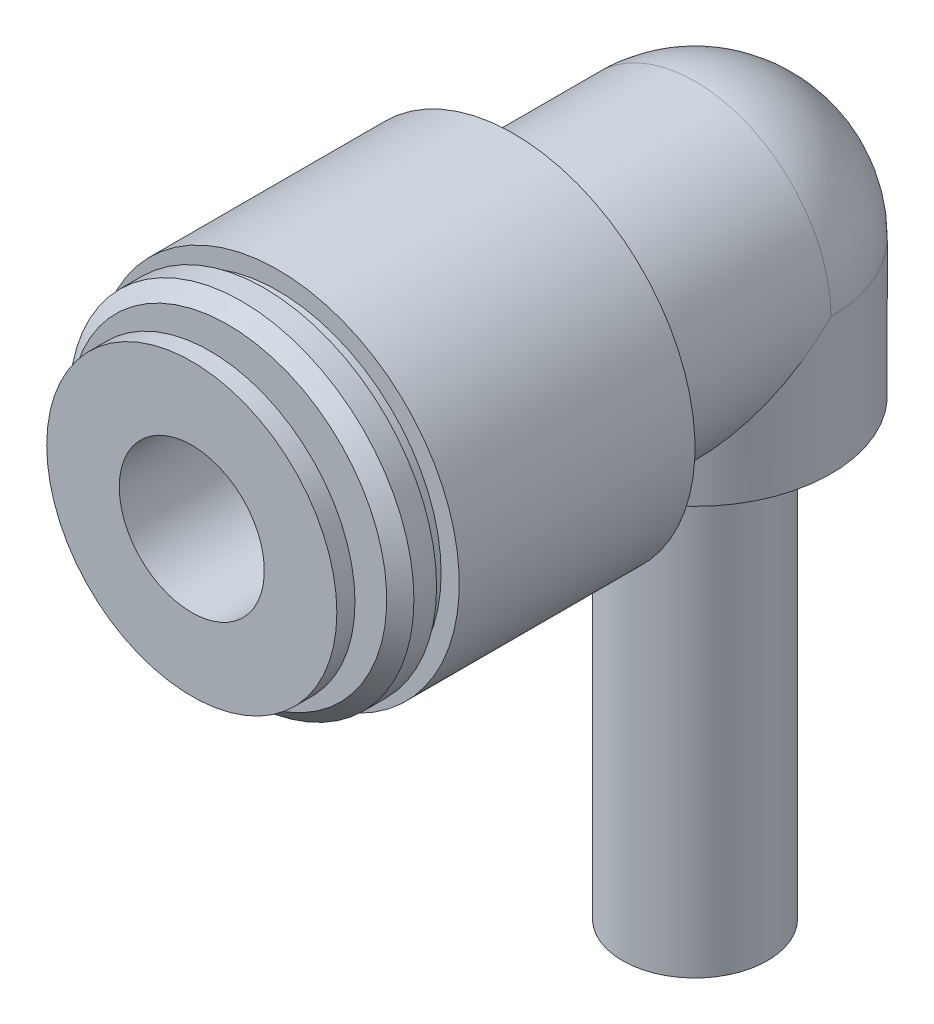
ISO-10303-21;
HEADER;
FILE_DESCRIPTION(('STEP AP214'),'2;1');
FILE_NAME('part.step','',(''),(''),'','','');
FILE_SCHEMA(('AUTOMOTIVE_DESIGN { 1 0 10303 214 1 1 1 1 }'));
ENDSEC;
DATA;
#1=APPLICATION_CONTEXT('core data for automotive mechanical design processes');
#2=APPLICATION_PROTOCOL_DEFINITION('international standard','automotive_design',2000,#1);
#3=PRODUCT_CONTEXT('',#1,'mechanical');
#4=PRODUCT('Part','Part','',(#3));
#5=PRODUCT_RELATED_PRODUCT_CATEGORY('part','',(#4));
#6=PRODUCT_DEFINITION_FORMATION('','',#4);
#7=PRODUCT_DEFINITION_CONTEXT('part definition',#1,'design');
#8=PRODUCT_DEFINITION('design','',#6,#7);
#9=PRODUCT_DEFINITION_SHAPE('','',#8);
#10=(LENGTH_UNIT() NAMED_UNIT(*) SI_UNIT(.MILLI.,.METRE.));
#11=(NAMED_UNIT(*) PLANE_ANGLE_UNIT() SI_UNIT($,.RADIAN.));
#12=(NAMED_UNIT(*) SI_UNIT($,.STERADIAN.) SOLID_ANGLE_UNIT());
#13=UNCERTAINTY_MEASURE_WITH_UNIT(LENGTH_MEASURE(1.E-05),#10,'distance_accuracy_value','');
#14=(GEOMETRIC_REPRESENTATION_CONTEXT(3) GLOBAL_UNCERTAINTY_ASSIGNED_CONTEXT((#13)) GLOBAL_UNIT_ASSIGNED_CONTEXT((#10,
#11,#12)) REPRESENTATION_CONTEXT('',''));
#15=CARTESIAN_POINT('',(0.,0.,0.));
#16=DIRECTION('',(0.,0.,1.));
#17=DIRECTION('',(1.,0.,0.));
#18=AXIS2_PLACEMENT_3D('',#15,#16,#17);
#19=CARTESIAN_POINT('',(0.,25.,0.));
#20=DIRECTION('',(0.,-1.,0.));
#21=DIRECTION('',(0.,0.,-1.));
#22=AXIS2_PLACEMENT_3D('',#19,#20,#21);
#23=CYLINDRICAL_SURFACE('',#22,7.5);
#24=CARTESIAN_POINT('',(0.,32.5,0.));
#25=DIRECTION('',(0.,-1.,0.));
#26=DIRECTION('',(0.,0.,-1.));
#27=AXIS2_PLACEMENT_3D('',#24,#25,#26);
#28=CIRCLE('',#27,7.5);
#29=CARTESIAN_POINT('',(-7.5,32.5,0.));
#30=VERTEX_POINT('',#29);
#31=CARTESIAN_POINT('',(7.5,32.5,0.));
#32=VERTEX_POINT('',#31);
#33=EDGE_CURVE('E68',#30,#32,#28,.T.);
#34=ORIENTED_EDGE('',*,*,#33,.T.);
#35=CARTESIAN_POINT('',(0.,32.5,0.));
#36=DIRECTION('',(0.,-0.707106781186547,-0.707106781186547));
#37=DIRECTION('',(0.,-0.707106781186547,0.707106781186547));
#38=AXIS2_PLACEMENT_3D('',#35,#36,#37);
#39=ELLIPSE('',#38,10.6066017177982,7.5);
#40=CARTESIAN_POINT('',(0.,25.,7.5));
#41=VERTEX_POINT('',#40);
#42=EDGE_CURVE('E51',#32,#41,#39,.T.);
#43=ORIENTED_EDGE('',*,*,#42,.T.);
#44=CARTESIAN_POINT('',(0.,25.,0.));
#45=DIRECTION('',(0.,-1.,0.));
#46=DIRECTION('',(0.,0.,-1.));
#47=AXIS2_PLACEMENT_3D('',#44,#45,#46);
#48=CIRCLE('',#47,7.5);
#49=EDGE_CURVE('E70',#41,#41,#48,.T.);
#50=ORIENTED_EDGE('',*,*,#49,.F.);
#51=EDGE_CURVE('E55',#41,#30,#39,.T.);
#52=ORIENTED_EDGE('',*,*,#51,.T.);
#53=EDGE_LOOP('',(#34,#43,#50,#52));
#54=FACE_BOUND('',#53,.T.);
#55=ADVANCED_FACE('F36',(#54),#23,.T.);
#56=CARTESIAN_POINT('',(0.,32.5,0.));
#57=DIRECTION('',(0.,-1.,0.));
#58=DIRECTION('',(1.,0.,0.));
#59=AXIS2_PLACEMENT_3D('',#56,#57,#58);
#60=SPHERICAL_SURFACE('',#59,7.5);
#61=ORIENTED_EDGE('',*,*,#33,.F.);
#62=CARTESIAN_POINT('',(0.,32.5,0.));
#63=DIRECTION('',(0.,0.,1.));
#64=DIRECTION('',(1.,0.,0.));
#65=AXIS2_PLACEMENT_3D('',#62,#63,#64);
#66=CIRCLE('',#65,7.5);
#67=EDGE_CURVE('E57',#32,#30,#66,.T.);
#68=ORIENTED_EDGE('',*,*,#67,.F.);
#69=EDGE_LOOP('',(#61,#68));
#70=FACE_BOUND('',#69,.T.);
#71=ADVANCED_FACE('F72',(#70),#60,.T.);
#72=CARTESIAN_POINT('',(0.,0.,0.));
#73=DIRECTION('',(0.,1.,0.));
#74=DIRECTION('',(0.,0.,1.));
#75=AXIS2_PLACEMENT_3D('',#72,#73,#74);
#76=PLANE('',#75);
#77=CARTESIAN_POINT('',(0.,0.,0.));
#78=DIRECTION('',(0.,1.,0.));
#79=DIRECTION('',(0.,0.,1.));
#80=AXIS2_PLACEMENT_3D('',#77,#78,#79);
#81=CIRCLE('',#80,4.);
#82=CARTESIAN_POINT('',(0.,0.,4.));
#83=VERTEX_POINT('',#82);
#84=EDGE_CURVE('E40',#83,#83,#81,.T.);
#85=ORIENTED_EDGE('',*,*,#84,.F.);
#86=EDGE_LOOP('',(#85));
#87=FACE_BOUND('',#86,.T.);
#88=CARTESIAN_POINT('',(0.,0.,0.));
#89=DIRECTION('',(0.,1.,0.));
#90=DIRECTION('',(0.,0.,1.));
#91=AXIS2_PLACEMENT_3D('',#88,#89,#90);
#92=CIRCLE('',#91,3.);
#93=CARTESIAN_POINT('',(0.,0.,3.));
#94=VERTEX_POINT('',#93);
#95=EDGE_CURVE('E79',#94,#94,#92,.T.);
#96=ORIENTED_EDGE('',*,*,#95,.T.);
#97=EDGE_LOOP('',(#96));
#98=FACE_BOUND('',#97,.T.);
#99=ADVANCED_FACE('F87',(#87,#98),#76,.F.);
#100=CARTESIAN_POINT('',(0.,25.,0.));
#101=DIRECTION('',(0.,-1.,0.));
#102=DIRECTION('',(0.,0.,-1.));
#103=AXIS2_PLACEMENT_3D('',#100,#101,#102);
#104=CYLINDRICAL_SURFACE('',#103,4.);
#105=CARTESIAN_POINT('',(0.,25.,0.));
#106=DIRECTION('',(0.,1.,0.));
#107=DIRECTION('',(0.,0.,1.));
#108=AXIS2_PLACEMENT_3D('',#105,#106,#107);
#109=CIRCLE('',#108,4.);
#110=CARTESIAN_POINT('',(0.,25.,4.));
#111=VERTEX_POINT('',#110);
#112=EDGE_CURVE('E11',#111,#111,#109,.T.);
#113=ORIENTED_EDGE('',*,*,#112,.F.);
#114=EDGE_LOOP('',(#113));
#115=FACE_BOUND('',#114,.T.);
#116=ORIENTED_EDGE('',*,*,#84,.T.);
#117=EDGE_LOOP('',(#116));
#118=FACE_BOUND('',#117,.T.);
#119=ADVANCED_FACE('F38',(#115,#118),#104,.T.);
#120=CARTESIAN_POINT('',(0.,25.,0.));
#121=DIRECTION('',(0.,-1.,0.));
#122=DIRECTION('',(0.,0.,-1.));
#123=AXIS2_PLACEMENT_3D('',#120,#121,#122);
#124=CYLINDRICAL_SURFACE('',#123,3.);
#125=CARTESIAN_POINT('',(0.,25.,0.));
#126=DIRECTION('',(0.,1.,0.));
#127=DIRECTION('',(0.,0.,1.));
#128=AXIS2_PLACEMENT_3D('',#125,#126,#127);
#129=CIRCLE('',#128,3.);
#130=CARTESIAN_POINT('',(0.,25.,3.));
#131=VERTEX_POINT('',#130);
#132=EDGE_CURVE('E74',#131,#131,#129,.T.);
#133=ORIENTED_EDGE('',*,*,#132,.T.);
#134=EDGE_LOOP('',(#133));
#135=FACE_BOUND('',#134,.T.);
#136=ORIENTED_EDGE('',*,*,#95,.F.);
#137=EDGE_LOOP('',(#136));
#138=FACE_BOUND('',#137,.T.);
#139=ADVANCED_FACE('F93',(#135,#138),#124,.F.);
#140=CARTESIAN_POINT('',(0.,25.,0.));
#141=DIRECTION('',(0.,-1.,0.));
#142=DIRECTION('',(0.,0.,-1.));
#143=AXIS2_PLACEMENT_3D('',#140,#141,#142);
#144=PLANE('',#143);
#145=ORIENTED_EDGE('',*,*,#132,.F.);
#146=EDGE_LOOP('',(#145));
#147=FACE_BOUND('',#146,.T.);
#148=ADVANCED_FACE('F105',(#147),#144,.T.);
#149=ORIENTED_EDGE('',*,*,#49,.T.);
#150=EDGE_LOOP('',(#149));
#151=FACE_BOUND('',#150,.T.);
#152=ORIENTED_EDGE('',*,*,#112,.T.);
#153=EDGE_LOOP('',(#152));
#154=FACE_BOUND('',#153,.T.);
#155=ADVANCED_FACE('F103',(#151,#154),#144,.T.);
#156=CARTESIAN_POINT('',(0.,32.5,10.));
#157=DIRECTION('',(0.,0.,-1.));
#158=DIRECTION('',(-1.,0.,0.));
#159=AXIS2_PLACEMENT_3D('',#156,#157,#158);
#160=CYLINDRICAL_SURFACE('',#159,7.5);
#161=ORIENTED_EDGE('',*,*,#42,.F.);
#162=ORIENTED_EDGE('',*,*,#67,.T.);
#163=ORIENTED_EDGE('',*,*,#51,.F.);
#164=EDGE_LOOP('',(#161,#162,#163));
#165=FACE_BOUND('',#164,.T.);
#166=CARTESIAN_POINT('',(0.,32.5,10.));
#167=DIRECTION('',(0.,0.,1.));
#168=DIRECTION('',(1.,0.,0.));
#169=AXIS2_PLACEMENT_3D('',#166,#167,#168);
#170=CIRCLE('',#169,7.5);
#171=CARTESIAN_POINT('',(7.5,32.5,10.));
#172=VERTEX_POINT('',#171);
#173=EDGE_CURVE('E63',#172,#172,#170,.T.);
#174=ORIENTED_EDGE('',*,*,#173,.F.);
#175=EDGE_LOOP('',(#174));
#176=FACE_BOUND('',#175,.T.);
#177=ADVANCED_FACE('F58',(#165,#176),#160,.T.);
#178=CARTESIAN_POINT('',(0.,32.5,23.));
#179=DIRECTION('',(0.,0.,-1.));
#180=DIRECTION('',(-1.,0.,0.));
#181=AXIS2_PLACEMENT_3D('',#178,#179,#180);
#182=CYLINDRICAL_SURFACE('',#181,10.);
#183=CARTESIAN_POINT('',(0.,32.5,23.));
#184=DIRECTION('',(0.,0.,1.));
#185=DIRECTION('',(1.,0.,0.));
#186=AXIS2_PLACEMENT_3D('',#183,#184,#185);
#187=CIRCLE('',#186,10.);
#188=CARTESIAN_POINT('',(-10.,32.5,23.));
#189=VERTEX_POINT('',#188);
#190=EDGE_CURVE('E64',#189,#189,#187,.T.);
#191=CARTESIAN_POINT('',(0.,32.5,10.));
#192=DIRECTION('',(0.,0.,1.));
#193=DIRECTION('',(1.,0.,0.));
#194=AXIS2_PLACEMENT_3D('',#191,#192,#193);
#195=CIRCLE('',#194,10.);
#196=CARTESIAN_POINT('',(-10.,32.5,10.));
#197=VERTEX_POINT('',#196);
#198=EDGE_CURVE('E345',#197,#197,#195,.T.);
#199=CARTESIAN_POINT('',(-10.,32.5,23.));
#200=CARTESIAN_POINT('',(-10.,32.5,22.8645833333333));
#201=CARTESIAN_POINT('',(-10.,32.5,22.7291666666667));
#202=CARTESIAN_POINT('',(-10.,32.5,22.4583333333333));
#203=CARTESIAN_POINT('',(-10.,32.5,22.3229166666667));
#204=CARTESIAN_POINT('',(-10.,32.5,22.0520833333333));
#205=CARTESIAN_POINT('',(-10.,32.5,21.9166666666667));
#206=CARTESIAN_POINT('',(-10.,32.5,21.6458333333333));
#207=CARTESIAN_POINT('',(-10.,32.5,21.5104166666667));
#208=CARTESIAN_POINT('',(-10.,32.5,21.2395833333333));
#209=CARTESIAN_POINT('',(-10.,32.5,21.1041666666667));
#210=CARTESIAN_POINT('',(-10.,32.5,20.8333333333333));
#211=CARTESIAN_POINT('',(-10.,32.5,20.6979166666667));
#212=CARTESIAN_POINT('',(-10.,32.5,20.4270833333333));
#213=CARTESIAN_POINT('',(-10.,32.5,20.2916666666667));
#214=CARTESIAN_POINT('',(-10.,32.5,20.0208333333333));
#215=CARTESIAN_POINT('',(-10.,32.5,19.8854166666667));
#216=CARTESIAN_POINT('',(-10.,32.5,19.6145833333333));
#217=CARTESIAN_POINT('',(-10.,32.5,19.4791666666667));
#218=CARTESIAN_POINT('',(-10.,32.5,19.2083333333333));
#219=CARTESIAN_POINT('',(-10.,32.5,19.0729166666667));
#220=CARTESIAN_POINT('',(-10.,32.5,18.8020833333333));
#221=CARTESIAN_POINT('',(-10.,32.5,18.6666666666667));
#222=CARTESIAN_POINT('',(-10.,32.5,18.3958333333333));
#223=CARTESIAN_POINT('',(-10.,32.5,18.2604166666667));
#224=CARTESIAN_POINT('',(-10.,32.5,17.9895833333333));
#225=CARTESIAN_POINT('',(-10.,32.5,17.8541666666667));
#226=CARTESIAN_POINT('',(-10.,32.5,17.5833333333333));
#227=CARTESIAN_POINT('',(-10.,32.5,17.4479166666667));
#228=CARTESIAN_POINT('',(-10.,32.5,17.1770833333333));
#229=CARTESIAN_POINT('',(-10.,32.5,17.0416666666667));
#230=CARTESIAN_POINT('',(-10.,32.5,16.7708333333333));
#231=CARTESIAN_POINT('',(-10.,32.5,16.6354166666667));
#232=CARTESIAN_POINT('',(-10.,32.5,16.3645833333333));
#233=CARTESIAN_POINT('',(-10.,32.5,16.2291666666667));
#234=CARTESIAN_POINT('',(-10.,32.5,15.9583333333333));
#235=CARTESIAN_POINT('',(-10.,32.5,15.8229166666667));
#236=CARTESIAN_POINT('',(-10.,32.5,15.5520833333333));
#237=CARTESIAN_POINT('',(-10.,32.5,15.4166666666667));
#238=CARTESIAN_POINT('',(-10.,32.5,15.1458333333333));
#239=CARTESIAN_POINT('',(-10.,32.5,15.0104166666667));
#240=CARTESIAN_POINT('',(-10.,32.5,14.7395833333333));
#241=CARTESIAN_POINT('',(-10.,32.5,14.6041666666667));
#242=CARTESIAN_POINT('',(-10.,32.5,14.3333333333333));
#243=CARTESIAN_POINT('',(-10.,32.5,14.1979166666667));
#244=CARTESIAN_POINT('',(-10.,32.5,13.9270833333333));
#245=CARTESIAN_POINT('',(-10.,32.5,13.7916666666667));
#246=CARTESIAN_POINT('',(-10.,32.5,13.5208333333333));
#247=CARTESIAN_POINT('',(-10.,32.5,13.3854166666667));
#248=CARTESIAN_POINT('',(-10.,32.5,13.1145833333333));
#249=CARTESIAN_POINT('',(-10.,32.5,12.9791666666667));
#250=CARTESIAN_POINT('',(-10.,32.5,12.7083333333333));
#251=CARTESIAN_POINT('',(-10.,32.5,12.5729166666667));
#252=CARTESIAN_POINT('',(-10.,32.5,12.3020833333333));
#253=CARTESIAN_POINT('',(-10.,32.5,12.1666666666667));
#254=CARTESIAN_POINT('',(-10.,32.5,11.8958333333333));
#255=CARTESIAN_POINT('',(-10.,32.5,11.7604166666667));
#256=CARTESIAN_POINT('',(-10.,32.5,11.4895833333333));
#257=CARTESIAN_POINT('',(-10.,32.5,11.3541666666667));
#258=CARTESIAN_POINT('',(-10.,32.5,11.0833333333333));
#259=CARTESIAN_POINT('',(-10.,32.5,10.9479166666667));
#260=CARTESIAN_POINT('',(-10.,32.5,10.6770833333333));
#261=CARTESIAN_POINT('',(-10.,32.5,10.5416666666667));
#262=CARTESIAN_POINT('',(-10.,32.5,10.2708333333333));
#263=CARTESIAN_POINT('',(-10.,32.5,10.1354166666667));
#264=CARTESIAN_POINT('',(-10.,32.5,10.));
#265=B_SPLINE_CURVE_WITH_KNOTS('',3,(#199,#200,#201,#202,#203,#204,#205,#206,#207,#208,#209,
#210,#211,#212,#213,#214,#215,#216,#217,#218,#219,#220,#221,#222,#223,#224,#225,#226,#227,#228,
#229,#230,#231,#232,#233,#234,#235,#236,#237,#238,#239,#240,#241,#242,#243,#244,#245,#246,#247,
#248,#249,#250,#251,#252,#253,#254,#255,#256,#257,#258,#259,#260,#261,#262,#263,#264),
.UNSPECIFIED.,.F.,.F.,(4,2,2,2,2,2,2,2,2,2,2,2,2,2,2,2,2,2,2,2,2,2,2,2,2,2,2,2,2,2,2,2,4),(0.,
0.406249999999997,0.812499999999997,1.21875,1.625,2.03125,2.4375,2.84375,3.25,3.65625,4.0625,
4.46875,4.875,5.28125,5.6875,6.09375,6.5,6.90625,7.3125,7.71875,8.125,8.53124999999999,8.9375,
9.34375,9.75,10.15625,10.5625,10.96875,11.375,11.78125,12.1875,12.59375,13.),.UNSPECIFIED.);
#266=EDGE_CURVE('BSEAM127',#189,#197,#265,.T.);
#267=ORIENTED_EDGE('',*,*,#190,.F.);
#268=ORIENTED_EDGE('',*,*,#198,.T.);
#269=ORIENTED_EDGE('',*,*,#266,.T.);
#270=ORIENTED_EDGE('',*,*,#266,.F.);
#271=EDGE_LOOP('',(#267,#269,#268,#270));
#272=FACE_BOUND('',#271,.T.);
#273=ADVANCED_FACE('F127',(#272),#182,.T.);
#274=CARTESIAN_POINT('',(0.,32.5,23.));
#275=DIRECTION('',(0.,0.,1.));
#276=DIRECTION('',(1.,0.,0.));
#277=AXIS2_PLACEMENT_3D('',#274,#275,#276);
#278=PLANE('',#277);
#279=CARTESIAN_POINT('',(0.,32.5,23.));
#280=DIRECTION('',(0.,0.,-1.));
#281=DIRECTION('',(-1.,0.,0.));
#282=AXIS2_PLACEMENT_3D('',#279,#280,#281);
#283=CIRCLE('',#282,8.99999999999996);
#284=CARTESIAN_POINT('',(-8.99999999999996,32.5,23.));
#285=VERTEX_POINT('',#284);
#286=EDGE_CURVE('E313',#285,#285,#283,.T.);
#287=ORIENTED_EDGE('',*,*,#286,.T.);
#288=EDGE_LOOP('',(#287));
#289=FACE_BOUND('',#288,.T.);
#290=ORIENTED_EDGE('',*,*,#190,.T.);
#291=EDGE_LOOP('',(#290));
#292=FACE_BOUND('',#291,.T.);
#293=ADVANCED_FACE('F133',(#289,#292),#278,.T.);
#294=CARTESIAN_POINT('',(0.,32.5,10.));
#295=DIRECTION('',(0.,0.,1.));
#296=DIRECTION('',(1.,0.,0.));
#297=AXIS2_PLACEMENT_3D('',#294,#295,#296);
#298=PLANE('',#297);
#299=ORIENTED_EDGE('',*,*,#173,.T.);
#300=EDGE_LOOP('',(#299));
#301=FACE_BOUND('',#300,.T.);
#302=ORIENTED_EDGE('',*,*,#198,.F.);
#303=EDGE_LOOP('',(#302));
#304=FACE_BOUND('',#303,.T.);
#305=ADVANCED_FACE('F142',(#301,#304),#298,.F.);
#306=CARTESIAN_POINT('',(0.,32.5,23.));
#307=DIRECTION('',(0.,0.,-1.));
#308=DIRECTION('',(-1.,0.,0.));
#309=AXIS2_PLACEMENT_3D('',#306,#307,#308);
#310=CYLINDRICAL_SURFACE('',#309,4.);
#311=CARTESIAN_POINT('',(0.,32.5,27.75));
#312=DIRECTION('',(0.,0.,-1.));
#313=DIRECTION('',(-1.,0.,0.));
#314=AXIS2_PLACEMENT_3D('',#311,#312,#313);
#315=CIRCLE('',#314,4.);
#316=CARTESIAN_POINT('',(-4.,32.5,27.75));
#317=VERTEX_POINT('',#316);
#318=EDGE_CURVE('E342',#317,#317,#315,.T.);
#319=ORIENTED_EDGE('',*,*,#318,.F.);
#320=EDGE_LOOP('',(#319));
#321=FACE_BOUND('',#320,.T.);
#322=CARTESIAN_POINT('',(0.,32.5,-0.249999999999979));
#323=DIRECTION('',(0.,0.,1.));
#324=DIRECTION('',(1.,0.,0.));
#325=AXIS2_PLACEMENT_3D('',#322,#323,#324);
#326=CIRCLE('',#325,4.);
#327=CARTESIAN_POINT('',(4.,32.5,-0.249999999999979));
#328=VERTEX_POINT('',#327);
#329=EDGE_CURVE('E311',#328,#328,#326,.T.);
#330=ORIENTED_EDGE('',*,*,#329,.F.);
#331=EDGE_LOOP('',(#330));
#332=FACE_BOUND('',#331,.T.);
#333=ADVANCED_FACE('F150',(#321,#332),#310,.F.);
#334=CARTESIAN_POINT('',(0.,28.5,27.75));
#335=DIRECTION('',(0.,0.,-1.));
#336=DIRECTION('',(-1.,0.,0.));
#337=AXIS2_PLACEMENT_3D('',#334,#335,#336);
#338=PLANE('',#337);
#339=CARTESIAN_POINT('',(0.,32.5,27.75));
#340=DIRECTION('',(0.,0.,-1.));
#341=DIRECTION('',(-1.,0.,0.));
#342=AXIS2_PLACEMENT_3D('',#339,#340,#341);
#343=CIRCLE('',#342,8.);
#344=CARTESIAN_POINT('',(-8.,32.5,27.75));
#345=VERTEX_POINT('',#344);
#346=EDGE_CURVE('E339',#345,#345,#343,.T.);
#347=ORIENTED_EDGE('',*,*,#346,.F.);
#348=EDGE_LOOP('',(#347));
#349=FACE_BOUND('',#348,.T.);
#350=ORIENTED_EDGE('',*,*,#318,.T.);
#351=EDGE_LOOP('',(#350));
#352=FACE_BOUND('',#351,.T.);
#353=ADVANCED_FACE('F158',(#349,#352),#338,.F.);
#354=CARTESIAN_POINT('',(0.,32.5,23.));
#355=DIRECTION('',(0.,0.,-1.));
#356=DIRECTION('',(-1.,0.,0.));
#357=AXIS2_PLACEMENT_3D('',#354,#355,#356);
#358=CYLINDRICAL_SURFACE('',#357,8.);
#359=CARTESIAN_POINT('',(0.,32.5,26.7499999999999));
#360=DIRECTION('',(0.,0.,-1.));
#361=DIRECTION('',(-1.,0.,0.));
#362=AXIS2_PLACEMENT_3D('',#359,#360,#361);
#363=CIRCLE('',#362,8.);
#364=CARTESIAN_POINT('',(-8.,32.5,26.7499999999999));
#365=VERTEX_POINT('',#364);
#366=EDGE_CURVE('E336',#365,#365,#363,.T.);
#367=ORIENTED_EDGE('',*,*,#366,.F.);
#368=EDGE_LOOP('',(#367));
#369=FACE_BOUND('',#368,.T.);
#370=ORIENTED_EDGE('',*,*,#346,.T.);
#371=EDGE_LOOP('',(#370));
#372=FACE_BOUND('',#371,.T.);
#373=ADVANCED_FACE('F166',(#369,#372),#358,.T.);
#374=CARTESIAN_POINT('',(0.,24.5,26.7499999999999));
#375=DIRECTION('',(0.,0.,1.));
#376=DIRECTION('',(1.,0.,0.));
#377=AXIS2_PLACEMENT_3D('',#374,#375,#376);
#378=PLANE('',#377);
#379=CARTESIAN_POINT('',(0.,32.5,26.7499999999999));
#380=DIRECTION('',(0.,0.,-1.));
#381=DIRECTION('',(-1.,0.,0.));
#382=AXIS2_PLACEMENT_3D('',#379,#380,#381);
#383=CIRCLE('',#382,5.99999999999998);
#384=CARTESIAN_POINT('',(-5.99999999999998,32.5,26.7499999999999));
#385=VERTEX_POINT('',#384);
#386=EDGE_CURVE('E333',#385,#385,#383,.T.);
#387=ORIENTED_EDGE('',*,*,#386,.F.);
#388=EDGE_LOOP('',(#387));
#389=FACE_BOUND('',#388,.T.);
#390=ORIENTED_EDGE('',*,*,#366,.T.);
#391=EDGE_LOOP('',(#390));
#392=FACE_BOUND('',#391,.T.);
#393=ADVANCED_FACE('F173',(#389,#392),#378,.F.);
#394=CARTESIAN_POINT('',(0.,32.5,23.));
#395=DIRECTION('',(0.,0.,-1.));
#396=DIRECTION('',(-1.,0.,0.));
#397=AXIS2_PLACEMENT_3D('',#394,#395,#396);
#398=CYLINDRICAL_SURFACE('',#397,5.99999999999998);
#399=CARTESIAN_POINT('',(0.,32.5,25.75));
#400=DIRECTION('',(0.,0.,-1.));
#401=DIRECTION('',(-1.,0.,0.));
#402=AXIS2_PLACEMENT_3D('',#399,#400,#401);
#403=CIRCLE('',#402,5.99999999999998);
#404=CARTESIAN_POINT('',(-5.99999999999998,32.5,25.75));
#405=VERTEX_POINT('',#404);
#406=EDGE_CURVE('E330',#405,#405,#403,.T.);
#407=ORIENTED_EDGE('',*,*,#406,.F.);
#408=EDGE_LOOP('',(#407));
#409=FACE_BOUND('',#408,.T.);
#410=ORIENTED_EDGE('',*,*,#386,.T.);
#411=EDGE_LOOP('',(#410));
#412=FACE_BOUND('',#411,.T.);
#413=ADVANCED_FACE('F182',(#409,#412),#398,.T.);
#414=CARTESIAN_POINT('',(0.,26.5,25.75));
#415=DIRECTION('',(0.,0.,-1.));
#416=DIRECTION('',(-1.,0.,0.));
#417=AXIS2_PLACEMENT_3D('',#414,#415,#416);
#418=PLANE('',#417);
#419=CARTESIAN_POINT('',(0.,32.5,25.75));
#420=DIRECTION('',(0.,0.,-1.));
#421=DIRECTION('',(-1.,0.,0.));
#422=AXIS2_PLACEMENT_3D('',#419,#420,#421);
#423=CIRCLE('',#422,8.74999999999998);
#424=CARTESIAN_POINT('',(-8.74999999999998,32.5,25.75));
#425=VERTEX_POINT('',#424);
#426=EDGE_CURVE('E327',#425,#425,#423,.T.);
#427=ORIENTED_EDGE('',*,*,#426,.F.);
#428=EDGE_LOOP('',(#427));
#429=FACE_BOUND('',#428,.T.);
#430=ORIENTED_EDGE('',*,*,#406,.T.);
#431=EDGE_LOOP('',(#430));
#432=FACE_BOUND('',#431,.T.);
#433=ADVANCED_FACE('F190',(#429,#432),#418,.F.);
#434=CARTESIAN_POINT('',(0.,32.5,25.75));
#435=DIRECTION('',(0.,0.,-1.));
#436=DIRECTION('',(-1.,0.,0.));
#437=AXIS2_PLACEMENT_3D('',#434,#435,#436);
#438=CONICAL_SURFACE('',#437,8.74999999999998,0.785398163397448);
#439=CARTESIAN_POINT('',(0.,32.5,25.));
#440=DIRECTION('',(0.,0.,-1.));
#441=DIRECTION('',(-1.,0.,0.));
#442=AXIS2_PLACEMENT_3D('',#439,#440,#441);
#443=CIRCLE('',#442,9.49999999999998);
#444=CARTESIAN_POINT('',(-9.49999999999998,32.5,25.));
#445=VERTEX_POINT('',#444);
#446=EDGE_CURVE('E324',#445,#445,#443,.T.);
#447=ORIENTED_EDGE('',*,*,#446,.F.);
#448=EDGE_LOOP('',(#447));
#449=FACE_BOUND('',#448,.T.);
#450=ORIENTED_EDGE('',*,*,#426,.T.);
#451=EDGE_LOOP('',(#450));
#452=FACE_BOUND('',#451,.T.);
#453=ADVANCED_FACE('F197',(#449,#452),#438,.T.);
#454=CARTESIAN_POINT('',(0.,32.5,23.));
#455=DIRECTION('',(0.,0.,-1.));
#456=DIRECTION('',(-1.,0.,0.));
#457=AXIS2_PLACEMENT_3D('',#454,#455,#456);
#458=CYLINDRICAL_SURFACE('',#457,9.49999999999998);
#459=CARTESIAN_POINT('',(0.,32.5,23.75));
#460=DIRECTION('',(0.,0.,-1.));
#461=DIRECTION('',(-1.,0.,0.));
#462=AXIS2_PLACEMENT_3D('',#459,#460,#461);
#463=CIRCLE('',#462,9.49999999999998);
#464=CARTESIAN_POINT('',(-9.49999999999998,32.5,23.75));
#465=VERTEX_POINT('',#464);
#466=EDGE_CURVE('E321',#465,#465,#463,.T.);
#467=ORIENTED_EDGE('',*,*,#466,.F.);
#468=EDGE_LOOP('',(#467));
#469=FACE_BOUND('',#468,.T.);
#470=ORIENTED_EDGE('',*,*,#446,.T.);
#471=EDGE_LOOP('',(#470));
#472=FACE_BOUND('',#471,.T.);
#473=ADVANCED_FACE('F205',(#469,#472),#458,.T.);
#474=CARTESIAN_POINT('',(0.,23.,23.75));
#475=DIRECTION('',(0.,0.,1.));
#476=DIRECTION('',(1.,0.,0.));
#477=AXIS2_PLACEMENT_3D('',#474,#475,#476);
#478=PLANE('',#477);
#479=CARTESIAN_POINT('',(0.,32.5,23.75));
#480=DIRECTION('',(0.,0.,-1.));
#481=DIRECTION('',(-1.,0.,0.));
#482=AXIS2_PLACEMENT_3D('',#479,#480,#481);
#483=CIRCLE('',#482,8.99999999999996);
#484=CARTESIAN_POINT('',(-8.99999999999996,32.5,23.75));
#485=VERTEX_POINT('',#484);
#486=EDGE_CURVE('E316',#485,#485,#483,.T.);
#487=ORIENTED_EDGE('',*,*,#486,.F.);
#488=EDGE_LOOP('',(#487));
#489=FACE_BOUND('',#488,.T.);
#490=ORIENTED_EDGE('',*,*,#466,.T.);
#491=EDGE_LOOP('',(#490));
#492=FACE_BOUND('',#491,.T.);
#493=ADVANCED_FACE('F213',(#489,#492),#478,.F.);
#494=CARTESIAN_POINT('',(0.,32.5,23.));
#495=DIRECTION('',(0.,0.,-1.));
#496=DIRECTION('',(-1.,0.,0.));
#497=AXIS2_PLACEMENT_3D('',#494,#495,#496);
#498=CYLINDRICAL_SURFACE('',#497,8.99999999999996);
#499=ORIENTED_EDGE('',*,*,#286,.F.);
#500=EDGE_LOOP('',(#499));
#501=FACE_BOUND('',#500,.T.);
#502=ORIENTED_EDGE('',*,*,#486,.T.);
#503=EDGE_LOOP('',(#502));
#504=FACE_BOUND('',#503,.T.);
#505=ADVANCED_FACE('F221',(#501,#504),#498,.T.);
#506=CARTESIAN_POINT('',(0.,32.5,-0.249999999999979));
#507=DIRECTION('',(0.,0.,1.));
#508=DIRECTION('',(1.,0.,0.));
#509=AXIS2_PLACEMENT_3D('',#506,#507,#508);
#510=PLANE('',#509);
#511=ORIENTED_EDGE('',*,*,#329,.T.);
#512=EDGE_LOOP('',(#511));
#513=FACE_BOUND('',#512,.T.);
#514=ADVANCED_FACE('F229',(#513),#510,.T.);
#515=CLOSED_SHELL('',(#55,#71,#99,#119,#139,#148,#155,#177,#273,#293,#305,#333,#353,#373,#393,
#413,#433,#453,#473,#493,#505,#514));
#516=MANIFOLD_SOLID_BREP('B2',#515);
#517=ADVANCED_BREP_SHAPE_REPRESENTATION('',(#18,#516),#14);
#518=SHAPE_DEFINITION_REPRESENTATION(#9,#517);
ENDSEC;
END-ISO-10303-21;
